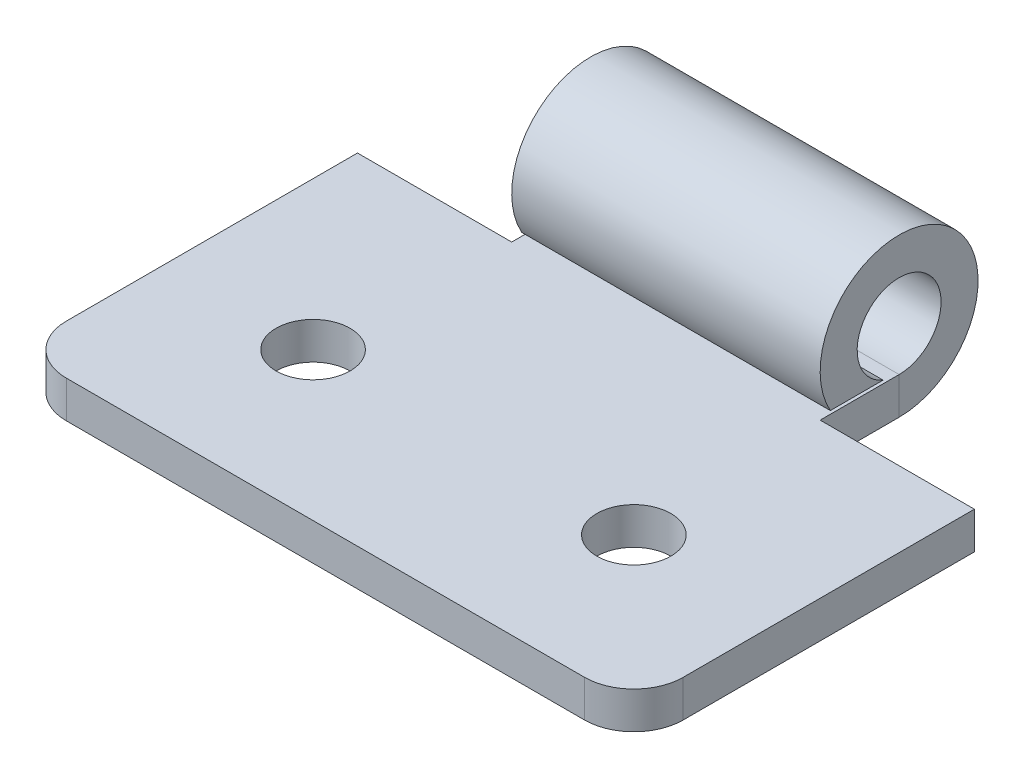
ISO-10303-21;
HEADER;
FILE_DESCRIPTION(('STEP AP214'),'2;1');
FILE_NAME('part.step','',(''),(''),'','','');
FILE_SCHEMA(('AUTOMOTIVE_DESIGN { 1 0 10303 214 1 1 1 1 }'));
ENDSEC;
DATA;
#1=APPLICATION_CONTEXT('core data for automotive mechanical design processes');
#2=APPLICATION_PROTOCOL_DEFINITION('international standard','automotive_design',2000,#1);
#3=PRODUCT_CONTEXT('',#1,'mechanical');
#4=PRODUCT('Part','Part','',(#3));
#5=PRODUCT_RELATED_PRODUCT_CATEGORY('part','',(#4));
#6=PRODUCT_DEFINITION_FORMATION('','',#4);
#7=PRODUCT_DEFINITION_CONTEXT('part definition',#1,'design');
#8=PRODUCT_DEFINITION('design','',#6,#7);
#9=PRODUCT_DEFINITION_SHAPE('','',#8);
#10=(LENGTH_UNIT() NAMED_UNIT(*) SI_UNIT(.MILLI.,.METRE.));
#11=(NAMED_UNIT(*) PLANE_ANGLE_UNIT() SI_UNIT($,.RADIAN.));
#12=(NAMED_UNIT(*) SI_UNIT($,.STERADIAN.) SOLID_ANGLE_UNIT());
#13=UNCERTAINTY_MEASURE_WITH_UNIT(LENGTH_MEASURE(1.E-05),#10,'distance_accuracy_value','');
#14=(GEOMETRIC_REPRESENTATION_CONTEXT(3) GLOBAL_UNCERTAINTY_ASSIGNED_CONTEXT((#13)) GLOBAL_UNIT_ASSIGNED_CONTEXT((#10,
#11,#12)) REPRESENTATION_CONTEXT('',''));
#15=CARTESIAN_POINT('',(0.,0.,0.));
#16=DIRECTION('',(0.,0.,1.));
#17=DIRECTION('',(1.,0.,0.));
#18=AXIS2_PLACEMENT_3D('',#15,#16,#17);
#19=CARTESIAN_POINT('',(6.24999999999998,1.7,-17.));
#20=DIRECTION('',(1.,0.,0.));
#21=DIRECTION('',(0.,0.,-1.));
#22=AXIS2_PLACEMENT_3D('',#19,#20,#21);
#23=CYLINDRICAL_SURFACE('',#22,1.7);
#24=CARTESIAN_POINT('',(18.75,1.7,-17.));
#25=DIRECTION('',(-1.,0.,0.));
#26=DIRECTION('',(0.,0.,-1.));
#27=AXIS2_PLACEMENT_3D('',#24,#25,#26);
#28=CIRCLE('',#27,1.7);
#29=CARTESIAN_POINT('',(18.75,0.129053697106962,-16.3502864373998));
#30=VERTEX_POINT('',#29);
#31=CARTESIAN_POINT('',(18.75,0.,-17.));
#32=VERTEX_POINT('',#31);
#33=EDGE_CURVE('E110',#30,#32,#28,.T.);
#34=ORIENTED_EDGE('',*,*,#33,.F.);
#35=DIRECTION('',(1.,0.,0.));
#36=VECTOR('',#35,1.);
#37=CARTESIAN_POINT('',(6.24999999999998,0.129053697106962,-16.3502864373998));
#38=LINE('',#37,#36);
#39=CARTESIAN_POINT('',(6.24999999999998,0.129053697106962,-16.3502864373998));
#40=VERTEX_POINT('',#39);
#41=EDGE_CURVE('E12',#40,#30,#38,.T.);
#42=ORIENTED_EDGE('',*,*,#41,.F.);
#43=CARTESIAN_POINT('',(6.24999999999998,1.7,-17.));
#44=DIRECTION('',(-1.,0.,0.));
#45=DIRECTION('',(0.,0.,-1.));
#46=AXIS2_PLACEMENT_3D('',#43,#44,#45);
#47=CIRCLE('',#46,1.7);
#48=CARTESIAN_POINT('',(6.24999999999998,0.,-17.));
#49=VERTEX_POINT('',#48);
#50=EDGE_CURVE('E104',#40,#49,#47,.T.);
#51=ORIENTED_EDGE('',*,*,#50,.T.);
#52=DIRECTION('',(1.,0.,0.));
#53=VECTOR('',#52,1.);
#54=CARTESIAN_POINT('',(6.24999999999998,0.,-17.));
#55=LINE('',#54,#53);
#56=EDGE_CURVE('E49',#49,#32,#55,.T.);
#57=ORIENTED_EDGE('',*,*,#56,.T.);
#58=EDGE_LOOP('',(#34,#42,#51,#57));
#59=FACE_BOUND('',#58,.T.);
#60=ADVANCED_FACE('F46',(#59),#23,.F.);
#61=CARTESIAN_POINT('',(6.24999999999998,0.129053697106962,-14.2121463967011));
#62=DIRECTION('',(0.,-1.,0.));
#63=DIRECTION('',(0.,0.,-1.));
#64=AXIS2_PLACEMENT_3D('',#61,#62,#63);
#65=PLANE('',#64);
#66=DIRECTION('',(0.,0.,-1.));
#67=VECTOR('',#66,1.);
#68=CARTESIAN_POINT('',(18.75,0.129053697106962,-14.2121463967011));
#69=LINE('',#68,#67);
#70=CARTESIAN_POINT('',(18.75,0.12905369710696,-14.2121463967011));
#71=VERTEX_POINT('',#70);
#72=EDGE_CURVE('E106',#71,#30,#69,.T.);
#73=ORIENTED_EDGE('',*,*,#72,.F.);
#74=DIRECTION('',(1.,0.,0.));
#75=VECTOR('',#74,1.);
#76=CARTESIAN_POINT('',(6.24999999999998,0.12905369710696,-14.2121463967011));
#77=LINE('',#76,#75);
#78=CARTESIAN_POINT('',(6.24999999999998,0.12905369710696,-14.2121463967011));
#79=VERTEX_POINT('',#78);
#80=EDGE_CURVE('E55',#79,#71,#77,.T.);
#81=ORIENTED_EDGE('',*,*,#80,.F.);
#82=DIRECTION('',(0.,0.,-1.));
#83=VECTOR('',#82,1.);
#84=CARTESIAN_POINT('',(6.24999999999998,0.129053697106962,-14.2121463967011));
#85=LINE('',#84,#83);
#86=EDGE_CURVE('E101',#79,#40,#85,.T.);
#87=ORIENTED_EDGE('',*,*,#86,.T.);
#88=ORIENTED_EDGE('',*,*,#41,.T.);
#89=EDGE_LOOP('',(#73,#81,#87,#88));
#90=FACE_BOUND('',#89,.T.);
#91=ADVANCED_FACE('F120',(#90),#65,.T.);
#92=CARTESIAN_POINT('',(6.24999999999998,1.7,-17.));
#93=DIRECTION('',(1.,0.,0.));
#94=DIRECTION('',(0.,0.,-1.));
#95=AXIS2_PLACEMENT_3D('',#92,#93,#94);
#96=CYLINDRICAL_SURFACE('',#95,3.2);
#97=CARTESIAN_POINT('',(18.75,1.7,-17.));
#98=DIRECTION('',(1.,0.,0.));
#99=DIRECTION('',(0.,0.,-1.));
#100=AXIS2_PLACEMENT_3D('',#97,#98,#99);
#101=CIRCLE('',#100,3.2);
#102=CARTESIAN_POINT('',(18.75,-1.5,-17.));
#103=VERTEX_POINT('',#102);
#104=EDGE_CURVE('E96',#103,#71,#101,.T.);
#105=ORIENTED_EDGE('',*,*,#104,.F.);
#106=DIRECTION('',(1.,0.,0.));
#107=VECTOR('',#106,1.);
#108=CARTESIAN_POINT('',(6.24999999999998,-1.5,-17.));
#109=LINE('',#108,#107);
#110=CARTESIAN_POINT('',(6.24999999999998,-1.5,-17.));
#111=VERTEX_POINT('',#110);
#112=EDGE_CURVE('E91',#111,#103,#109,.T.);
#113=ORIENTED_EDGE('',*,*,#112,.F.);
#114=CARTESIAN_POINT('',(6.24999999999998,1.7,-17.));
#115=DIRECTION('',(1.,0.,0.));
#116=DIRECTION('',(0.,0.,-1.));
#117=AXIS2_PLACEMENT_3D('',#114,#115,#116);
#118=CIRCLE('',#117,3.2);
#119=EDGE_CURVE('E94',#111,#79,#118,.T.);
#120=ORIENTED_EDGE('',*,*,#119,.T.);
#121=ORIENTED_EDGE('',*,*,#80,.T.);
#122=EDGE_LOOP('',(#105,#113,#120,#121));
#123=FACE_BOUND('',#122,.T.);
#124=ADVANCED_FACE('F93',(#123),#96,.T.);
#125=CARTESIAN_POINT('',(6.24999999999998,0.,-17.));
#126=DIRECTION('',(0.,0.,1.));
#127=DIRECTION('',(1.,0.,0.));
#128=AXIS2_PLACEMENT_3D('',#125,#126,#127);
#129=PLANE('',#128);
#130=DIRECTION('',(0.,-1.,0.));
#131=VECTOR('',#130,1.);
#132=CARTESIAN_POINT('',(18.75,0.,-17.));
#133=LINE('',#132,#131);
#134=EDGE_CURVE('E113',#32,#103,#133,.T.);
#135=ORIENTED_EDGE('',*,*,#134,.F.);
#136=ORIENTED_EDGE('',*,*,#56,.F.);
#137=DIRECTION('',(0.,-1.,0.));
#138=VECTOR('',#137,1.);
#139=CARTESIAN_POINT('',(6.24999999999998,0.,-17.));
#140=LINE('',#139,#138);
#141=EDGE_CURVE('E100',#49,#111,#140,.T.);
#142=ORIENTED_EDGE('',*,*,#141,.T.);
#143=ORIENTED_EDGE('',*,*,#112,.T.);
#144=EDGE_LOOP('',(#135,#136,#142,#143));
#145=FACE_BOUND('',#144,.T.);
#146=ADVANCED_FACE('F103',(#145),#129,.T.);
#147=CARTESIAN_POINT('',(6.24999999999998,1.7,-17.));
#148=DIRECTION('',(1.,0.,0.));
#149=DIRECTION('',(0.,0.,-1.));
#150=AXIS2_PLACEMENT_3D('',#147,#148,#149);
#151=PLANE('',#150);
#152=ORIENTED_EDGE('',*,*,#50,.F.);
#153=ORIENTED_EDGE('',*,*,#86,.F.);
#154=ORIENTED_EDGE('',*,*,#119,.F.);
#155=ORIENTED_EDGE('',*,*,#141,.F.);
#156=EDGE_LOOP('',(#152,#153,#154,#155));
#157=FACE_BOUND('',#156,.T.);
#158=ADVANCED_FACE('F99',(#157),#151,.F.);
#159=CARTESIAN_POINT('',(18.75,1.7,-17.));
#160=DIRECTION('',(1.,0.,0.));
#161=DIRECTION('',(0.,0.,-1.));
#162=AXIS2_PLACEMENT_3D('',#159,#160,#161);
#163=PLANE('',#162);
#164=ORIENTED_EDGE('',*,*,#33,.T.);
#165=ORIENTED_EDGE('',*,*,#134,.T.);
#166=ORIENTED_EDGE('',*,*,#104,.T.);
#167=ORIENTED_EDGE('',*,*,#72,.T.);
#168=EDGE_LOOP('',(#164,#165,#166,#167));
#169=FACE_BOUND('',#168,.T.);
#170=ADVANCED_FACE('F119',(#169),#163,.T.);
#171=CLOSED_SHELL('',(#60,#91,#124,#146,#158,#170));
#172=MANIFOLD_SOLID_BREP('B2',#171);
#173=CARTESIAN_POINT('',(0.,-1.5,0.));
#174=DIRECTION('',(-1.,0.,0.));
#175=DIRECTION('',(0.,0.,1.));
#176=AXIS2_PLACEMENT_3D('',#173,#174,#175);
#177=PLANE('',#176);
#178=DIRECTION('',(0.,1.,0.));
#179=VECTOR('',#178,1.);
#180=CARTESIAN_POINT('',(0.,-1.5,-13.8));
#181=LINE('',#180,#179);
#182=CARTESIAN_POINT('',(0.,-1.5,-13.8));
#183=VERTEX_POINT('',#182);
#184=CARTESIAN_POINT('',(0.,0.,-13.8));
#185=VERTEX_POINT('',#184);
#186=EDGE_CURVE('E283',#183,#185,#181,.T.);
#187=ORIENTED_EDGE('',*,*,#186,.F.);
#188=DIRECTION('',(0.,0.,1.));
#189=VECTOR('',#188,1.);
#190=CARTESIAN_POINT('',(0.,-1.5,0.));
#191=LINE('',#190,#189);
#192=CARTESIAN_POINT('',(0.,-1.5,-2.));
#193=VERTEX_POINT('',#192);
#194=EDGE_CURVE('E196',#183,#193,#191,.T.);
#195=ORIENTED_EDGE('',*,*,#194,.T.);
#196=DIRECTION('',(0.,1.,0.));
#197=VECTOR('',#196,1.);
#198=CARTESIAN_POINT('',(0.,-1.5,-2.));
#199=LINE('',#198,#197);
#200=CARTESIAN_POINT('',(0.,0.,-2.));
#201=VERTEX_POINT('',#200);
#202=EDGE_CURVE('E189',#193,#201,#199,.T.);
#203=ORIENTED_EDGE('',*,*,#202,.T.);
#204=DIRECTION('',(0.,0.,1.));
#205=VECTOR('',#204,1.);
#206=CARTESIAN_POINT('',(0.,0.,0.));
#207=LINE('',#206,#205);
#208=EDGE_CURVE('E321',#185,#201,#207,.T.);
#209=ORIENTED_EDGE('',*,*,#208,.F.);
#210=EDGE_LOOP('',(#187,#195,#203,#209));
#211=FACE_BOUND('',#210,.T.);
#212=ADVANCED_FACE('F181',(#211),#177,.T.);
#213=CARTESIAN_POINT('',(25.,-1.5,0.));
#214=DIRECTION('',(1.,0.,0.));
#215=DIRECTION('',(0.,0.,-1.));
#216=AXIS2_PLACEMENT_3D('',#213,#214,#215);
#217=PLANE('',#216);
#218=DIRECTION('',(0.,-1.,0.));
#219=VECTOR('',#218,1.);
#220=CARTESIAN_POINT('',(25.,-1.5,-13.8));
#221=LINE('',#220,#219);
#222=CARTESIAN_POINT('',(25.,0.,-13.8));
#223=VERTEX_POINT('',#222);
#224=CARTESIAN_POINT('',(25.,-1.5,-13.8));
#225=VERTEX_POINT('',#224);
#226=EDGE_CURVE('E295',#223,#225,#221,.T.);
#227=ORIENTED_EDGE('',*,*,#226,.F.);
#228=DIRECTION('',(0.,0.,-1.));
#229=VECTOR('',#228,1.);
#230=CARTESIAN_POINT('',(25.,0.,0.));
#231=LINE('',#230,#229);
#232=CARTESIAN_POINT('',(25.,0.,-2.));
#233=VERTEX_POINT('',#232);
#234=EDGE_CURVE('E325',#233,#223,#231,.T.);
#235=ORIENTED_EDGE('',*,*,#234,.F.);
#236=DIRECTION('',(0.,1.,0.));
#237=VECTOR('',#236,1.);
#238=CARTESIAN_POINT('',(25.,-1.5,-2.));
#239=LINE('',#238,#237);
#240=CARTESIAN_POINT('',(25.,-1.5,-2.));
#241=VERTEX_POINT('',#240);
#242=EDGE_CURVE('E204',#233,#241,#239,.F.);
#243=ORIENTED_EDGE('',*,*,#242,.T.);
#244=DIRECTION('',(0.,0.,-1.));
#245=VECTOR('',#244,1.);
#246=CARTESIAN_POINT('',(25.,-1.5,0.));
#247=LINE('',#246,#245);
#248=EDGE_CURVE('E328',#241,#225,#247,.T.);
#249=ORIENTED_EDGE('',*,*,#248,.T.);
#250=EDGE_LOOP('',(#227,#235,#243,#249));
#251=FACE_BOUND('',#250,.T.);
#252=ADVANCED_FACE('F364',(#251),#217,.T.);
#253=CARTESIAN_POINT('',(0.,-1.5,0.));
#254=DIRECTION('',(0.,0.,1.));
#255=DIRECTION('',(1.,0.,0.));
#256=AXIS2_PLACEMENT_3D('',#253,#254,#255);
#257=PLANE('',#256);
#258=DIRECTION('',(1.,0.,0.));
#259=VECTOR('',#258,1.);
#260=CARTESIAN_POINT('',(0.,-1.5,0.));
#261=LINE('',#260,#259);
#262=CARTESIAN_POINT('',(2.,-1.5,0.));
#263=VERTEX_POINT('',#262);
#264=CARTESIAN_POINT('',(23.,-1.5,0.));
#265=VERTEX_POINT('',#264);
#266=EDGE_CURVE('E324',#263,#265,#261,.T.);
#267=ORIENTED_EDGE('',*,*,#266,.T.);
#268=DIRECTION('',(0.,1.,0.));
#269=VECTOR('',#268,1.);
#270=CARTESIAN_POINT('',(23.,-1.5,0.));
#271=LINE('',#270,#269);
#272=CARTESIAN_POINT('',(23.,0.,0.));
#273=VERTEX_POINT('',#272);
#274=EDGE_CURVE('E338',#265,#273,#271,.T.);
#275=ORIENTED_EDGE('',*,*,#274,.T.);
#276=DIRECTION('',(1.,0.,0.));
#277=VECTOR('',#276,1.);
#278=CARTESIAN_POINT('',(0.,0.,0.));
#279=LINE('',#278,#277);
#280=CARTESIAN_POINT('',(2.,0.,0.));
#281=VERTEX_POINT('',#280);
#282=EDGE_CURVE('E332',#281,#273,#279,.T.);
#283=ORIENTED_EDGE('',*,*,#282,.F.);
#284=DIRECTION('',(0.,1.,0.));
#285=VECTOR('',#284,1.);
#286=CARTESIAN_POINT('',(2.,-1.5,0.));
#287=LINE('',#286,#285);
#288=EDGE_CURVE('E330',#281,#263,#287,.F.);
#289=ORIENTED_EDGE('',*,*,#288,.T.);
#290=EDGE_LOOP('',(#267,#275,#283,#289));
#291=FACE_BOUND('',#290,.T.);
#292=ADVANCED_FACE('F356',(#291),#257,.T.);
#293=CARTESIAN_POINT('',(0.,-1.5,0.));
#294=DIRECTION('',(0.,-1.,0.));
#295=DIRECTION('',(0.,0.,-1.));
#296=AXIS2_PLACEMENT_3D('',#293,#294,#295);
#297=PLANE('',#296);
#298=DIRECTION('',(-1.,0.,0.));
#299=VECTOR('',#298,1.);
#300=CARTESIAN_POINT('',(0.,-1.5,-13.8));
#301=LINE('',#300,#299);
#302=CARTESIAN_POINT('',(6.25000000000001,-1.5,-13.8));
#303=VERTEX_POINT('',#302);
#304=EDGE_CURVE('E280',#303,#183,#301,.T.);
#305=ORIENTED_EDGE('',*,*,#304,.F.);
#306=DIRECTION('',(0.,0.,1.));
#307=VECTOR('',#306,1.);
#308=CARTESIAN_POINT('',(6.25,-1.5,-17.));
#309=LINE('',#308,#307);
#310=CARTESIAN_POINT('',(6.25,-1.5,-17.));
#311=VERTEX_POINT('',#310);
#312=EDGE_CURVE('E277',#311,#303,#309,.T.);
#313=ORIENTED_EDGE('',*,*,#312,.F.);
#314=DIRECTION('',(-1.,0.,0.));
#315=VECTOR('',#314,1.);
#316=CARTESIAN_POINT('',(6.25,-1.5,-17.));
#317=LINE('',#316,#315);
#318=CARTESIAN_POINT('',(18.75,-1.5,-17.));
#319=VERTEX_POINT('',#318);
#320=EDGE_CURVE('E312',#319,#311,#317,.T.);
#321=ORIENTED_EDGE('',*,*,#320,.F.);
#322=DIRECTION('',(0.,0.,-1.));
#323=VECTOR('',#322,1.);
#324=CARTESIAN_POINT('',(18.75,-1.5,-15.));
#325=LINE('',#324,#323);
#326=CARTESIAN_POINT('',(18.75,-1.5,-13.8));
#327=VERTEX_POINT('',#326);
#328=EDGE_CURVE('E271',#327,#319,#325,.T.);
#329=ORIENTED_EDGE('',*,*,#328,.F.);
#330=DIRECTION('',(-1.,0.,0.));
#331=VECTOR('',#330,1.);
#332=CARTESIAN_POINT('',(0.,-1.5,-13.8));
#333=LINE('',#332,#331);
#334=EDGE_CURVE('E292',#225,#327,#333,.T.);
#335=ORIENTED_EDGE('',*,*,#334,.F.);
#336=ORIENTED_EDGE('',*,*,#248,.F.);
#337=CARTESIAN_POINT('',(23.,-1.5,-2.));
#338=DIRECTION('',(0.,-1.,0.));
#339=DIRECTION('',(0.,0.,-1.));
#340=AXIS2_PLACEMENT_3D('',#337,#338,#339);
#341=CIRCLE('',#340,2.);
#342=EDGE_CURVE('E348',#241,#265,#341,.T.);
#343=ORIENTED_EDGE('',*,*,#342,.T.);
#344=ORIENTED_EDGE('',*,*,#266,.F.);
#345=CARTESIAN_POINT('',(2.,-1.5,-2.));
#346=DIRECTION('',(0.,-1.,0.));
#347=DIRECTION('',(0.,0.,-1.));
#348=AXIS2_PLACEMENT_3D('',#345,#346,#347);
#349=CIRCLE('',#348,2.);
#350=EDGE_CURVE('E346',#263,#193,#349,.T.);
#351=ORIENTED_EDGE('',*,*,#350,.T.);
#352=ORIENTED_EDGE('',*,*,#194,.F.);
#353=EDGE_LOOP('',(#305,#313,#321,#329,#335,#336,#343,#344,#351,#352));
#354=FACE_BOUND('',#353,.T.);
#355=CARTESIAN_POINT('',(6.,-1.5,-6.));
#356=DIRECTION('',(0.,1.,0.));
#357=DIRECTION('',(0.,0.,1.));
#358=AXIS2_PLACEMENT_3D('',#355,#356,#357);
#359=CIRCLE('',#358,1.5);
#360=CARTESIAN_POINT('',(6.,-1.5,-4.5));
#361=VERTEX_POINT('',#360);
#362=EDGE_CURVE('E298',#361,#361,#359,.T.);
#363=ORIENTED_EDGE('',*,*,#362,.T.);
#364=EDGE_LOOP('',(#363));
#365=FACE_BOUND('',#364,.T.);
#366=CARTESIAN_POINT('',(19.,-1.5,-6.));
#367=DIRECTION('',(0.,1.,0.));
#368=DIRECTION('',(0.,0.,1.));
#369=AXIS2_PLACEMENT_3D('',#366,#367,#368);
#370=CIRCLE('',#369,1.5);
#371=CARTESIAN_POINT('',(19.,-1.5,-4.5));
#372=VERTEX_POINT('',#371);
#373=EDGE_CURVE('E304',#372,#372,#370,.T.);
#374=ORIENTED_EDGE('',*,*,#373,.T.);
#375=EDGE_LOOP('',(#374));
#376=FACE_BOUND('',#375,.T.);
#377=ADVANCED_FACE('F370',(#354,#365,#376),#297,.T.);
#378=CARTESIAN_POINT('',(0.,0.,0.));
#379=DIRECTION('',(0.,-1.,0.));
#380=DIRECTION('',(0.,0.,-1.));
#381=AXIS2_PLACEMENT_3D('',#378,#379,#380);
#382=PLANE('',#381);
#383=CARTESIAN_POINT('',(6.,0.,-6.));
#384=DIRECTION('',(0.,1.,0.));
#385=DIRECTION('',(0.,0.,1.));
#386=AXIS2_PLACEMENT_3D('',#383,#384,#385);
#387=CIRCLE('',#386,1.5);
#388=CARTESIAN_POINT('',(6.,0.,-4.5));
#389=VERTEX_POINT('',#388);
#390=EDGE_CURVE('E297',#389,#389,#387,.T.);
#391=ORIENTED_EDGE('',*,*,#390,.F.);
#392=EDGE_LOOP('',(#391));
#393=FACE_BOUND('',#392,.T.);
#394=CARTESIAN_POINT('',(19.,0.,-6.));
#395=DIRECTION('',(0.,1.,0.));
#396=DIRECTION('',(0.,0.,1.));
#397=AXIS2_PLACEMENT_3D('',#394,#395,#396);
#398=CIRCLE('',#397,1.5);
#399=CARTESIAN_POINT('',(19.,0.,-4.5));
#400=VERTEX_POINT('',#399);
#401=EDGE_CURVE('E301',#400,#400,#398,.T.);
#402=ORIENTED_EDGE('',*,*,#401,.F.);
#403=EDGE_LOOP('',(#402));
#404=FACE_BOUND('',#403,.T.);
#405=DIRECTION('',(0.,0.,1.));
#406=VECTOR('',#405,1.);
#407=CARTESIAN_POINT('',(6.25,0.,-17.));
#408=LINE('',#407,#406);
#409=CARTESIAN_POINT('',(6.25,0.,-17.));
#410=VERTEX_POINT('',#409);
#411=CARTESIAN_POINT('',(6.25000000000001,0.,-13.8));
#412=VERTEX_POINT('',#411);
#413=EDGE_CURVE('E262',#410,#412,#408,.T.);
#414=ORIENTED_EDGE('',*,*,#413,.T.);
#415=DIRECTION('',(-1.,0.,0.));
#416=VECTOR('',#415,1.);
#417=CARTESIAN_POINT('',(0.,0.,-13.8));
#418=LINE('',#417,#416);
#419=EDGE_CURVE('E44',#412,#185,#418,.T.);
#420=ORIENTED_EDGE('',*,*,#419,.T.);
#421=ORIENTED_EDGE('',*,*,#208,.T.);
#422=CARTESIAN_POINT('',(2.,0.,-2.));
#423=DIRECTION('',(0.,-1.,0.));
#424=DIRECTION('',(0.,0.,-1.));
#425=AXIS2_PLACEMENT_3D('',#422,#423,#424);
#426=CIRCLE('',#425,2.);
#427=EDGE_CURVE('E341',#201,#281,#426,.F.);
#428=ORIENTED_EDGE('',*,*,#427,.T.);
#429=ORIENTED_EDGE('',*,*,#282,.T.);
#430=CARTESIAN_POINT('',(23.,0.,-2.));
#431=DIRECTION('',(0.,-1.,0.));
#432=DIRECTION('',(0.,0.,-1.));
#433=AXIS2_PLACEMENT_3D('',#430,#431,#432);
#434=CIRCLE('',#433,2.);
#435=EDGE_CURVE('E343',#273,#233,#434,.F.);
#436=ORIENTED_EDGE('',*,*,#435,.T.);
#437=ORIENTED_EDGE('',*,*,#234,.T.);
#438=DIRECTION('',(1.,0.,0.));
#439=VECTOR('',#438,1.);
#440=CARTESIAN_POINT('',(18.75,0.,-13.8));
#441=LINE('',#440,#439);
#442=CARTESIAN_POINT('',(18.75,0.,-13.8));
#443=VERTEX_POINT('',#442);
#444=EDGE_CURVE('E284',#443,#223,#441,.T.);
#445=ORIENTED_EDGE('',*,*,#444,.F.);
#446=DIRECTION('',(0.,0.,-1.));
#447=VECTOR('',#446,1.);
#448=CARTESIAN_POINT('',(18.75,0.,-15.));
#449=LINE('',#448,#447);
#450=CARTESIAN_POINT('',(18.75,0.,-17.));
#451=VERTEX_POINT('',#450);
#452=EDGE_CURVE('E307',#443,#451,#449,.T.);
#453=ORIENTED_EDGE('',*,*,#452,.T.);
#454=DIRECTION('',(-1.,0.,0.));
#455=VECTOR('',#454,1.);
#456=CARTESIAN_POINT('',(6.25,0.,-17.));
#457=LINE('',#456,#455);
#458=EDGE_CURVE('E269',#451,#410,#457,.T.);
#459=ORIENTED_EDGE('',*,*,#458,.T.);
#460=EDGE_LOOP('',(#414,#420,#421,#428,#429,#436,#437,#445,#453,#459));
#461=FACE_BOUND('',#460,.T.);
#462=ADVANCED_FACE('F264',(#393,#404,#461),#382,.F.);
#463=CARTESIAN_POINT('',(18.75,-1.5,-15.));
#464=DIRECTION('',(1.,0.,0.));
#465=DIRECTION('',(0.,0.,-1.));
#466=AXIS2_PLACEMENT_3D('',#463,#464,#465);
#467=PLANE('',#466);
#468=ORIENTED_EDGE('',*,*,#452,.F.);
#469=DIRECTION('',(0.,1.,0.));
#470=VECTOR('',#469,1.);
#471=CARTESIAN_POINT('',(18.75,-25.,-13.8));
#472=LINE('',#471,#470);
#473=EDGE_CURVE('E286',#327,#443,#472,.T.);
#474=ORIENTED_EDGE('',*,*,#473,.F.);
#475=ORIENTED_EDGE('',*,*,#328,.T.);
#476=DIRECTION('',(0.,1.,0.));
#477=VECTOR('',#476,1.);
#478=CARTESIAN_POINT('',(18.75,-1.5,-17.));
#479=LINE('',#478,#477);
#480=EDGE_CURVE('E316',#319,#451,#479,.T.);
#481=ORIENTED_EDGE('',*,*,#480,.T.);
#482=EDGE_LOOP('',(#468,#474,#475,#481));
#483=FACE_BOUND('',#482,.T.);
#484=ADVANCED_FACE('F374',(#483),#467,.T.);
#485=CARTESIAN_POINT('',(6.25,-1.5,-17.));
#486=DIRECTION('',(-1.,0.,0.));
#487=DIRECTION('',(0.,0.,1.));
#488=AXIS2_PLACEMENT_3D('',#485,#486,#487);
#489=PLANE('',#488);
#490=ORIENTED_EDGE('',*,*,#413,.F.);
#491=DIRECTION('',(0.,1.,0.));
#492=VECTOR('',#491,1.);
#493=CARTESIAN_POINT('',(6.25,-1.5,-17.));
#494=LINE('',#493,#492);
#495=EDGE_CURVE('E319',#311,#410,#494,.T.);
#496=ORIENTED_EDGE('',*,*,#495,.F.);
#497=ORIENTED_EDGE('',*,*,#312,.T.);
#498=DIRECTION('',(0.,1.,0.));
#499=VECTOR('',#498,1.);
#500=CARTESIAN_POINT('',(6.25000000000001,-25.,-13.8));
#501=LINE('',#500,#499);
#502=EDGE_CURVE('E274',#303,#412,#501,.T.);
#503=ORIENTED_EDGE('',*,*,#502,.T.);
#504=EDGE_LOOP('',(#490,#496,#497,#503));
#505=FACE_BOUND('',#504,.T.);
#506=ADVANCED_FACE('F275',(#505),#489,.T.);
#507=CARTESIAN_POINT('',(6.25,-1.5,-17.));
#508=DIRECTION('',(0.,0.,-1.));
#509=DIRECTION('',(-1.,0.,0.));
#510=AXIS2_PLACEMENT_3D('',#507,#508,#509);
#511=PLANE('',#510);
#512=ORIENTED_EDGE('',*,*,#458,.F.);
#513=ORIENTED_EDGE('',*,*,#480,.F.);
#514=ORIENTED_EDGE('',*,*,#320,.T.);
#515=ORIENTED_EDGE('',*,*,#495,.T.);
#516=EDGE_LOOP('',(#512,#513,#514,#515));
#517=FACE_BOUND('',#516,.T.);
#518=ADVANCED_FACE('F376',(#517),#511,.T.);
#519=CARTESIAN_POINT('',(19.,-1.5,-6.));
#520=DIRECTION('',(0.,1.,0.));
#521=DIRECTION('',(0.,0.,1.));
#522=AXIS2_PLACEMENT_3D('',#519,#520,#521);
#523=CYLINDRICAL_SURFACE('',#522,1.5);
#524=ORIENTED_EDGE('',*,*,#373,.F.);
#525=EDGE_LOOP('',(#524));
#526=FACE_BOUND('',#525,.T.);
#527=ORIENTED_EDGE('',*,*,#401,.T.);
#528=EDGE_LOOP('',(#527));
#529=FACE_BOUND('',#528,.T.);
#530=ADVANCED_FACE('F378',(#526,#529),#523,.F.);
#531=CARTESIAN_POINT('',(6.,-1.5,-6.));
#532=DIRECTION('',(0.,1.,0.));
#533=DIRECTION('',(0.,0.,1.));
#534=AXIS2_PLACEMENT_3D('',#531,#532,#533);
#535=CYLINDRICAL_SURFACE('',#534,1.5);
#536=ORIENTED_EDGE('',*,*,#362,.F.);
#537=EDGE_LOOP('',(#536));
#538=FACE_BOUND('',#537,.T.);
#539=ORIENTED_EDGE('',*,*,#390,.T.);
#540=EDGE_LOOP('',(#539));
#541=FACE_BOUND('',#540,.T.);
#542=ADVANCED_FACE('F384',(#538,#541),#535,.F.);
#543=CARTESIAN_POINT('',(23.,-1.5,-2.));
#544=DIRECTION('',(0.,1.,0.));
#545=DIRECTION('',(0.,0.,1.));
#546=AXIS2_PLACEMENT_3D('',#543,#544,#545);
#547=CYLINDRICAL_SURFACE('',#546,2.);
#548=ORIENTED_EDGE('',*,*,#342,.F.);
#549=ORIENTED_EDGE('',*,*,#242,.F.);
#550=ORIENTED_EDGE('',*,*,#435,.F.);
#551=ORIENTED_EDGE('',*,*,#274,.F.);
#552=EDGE_LOOP('',(#548,#549,#550,#551));
#553=FACE_BOUND('',#552,.T.);
#554=ADVANCED_FACE('F361',(#553),#547,.T.);
#555=CARTESIAN_POINT('',(2.,-1.5,-2.));
#556=DIRECTION('',(0.,1.,0.));
#557=DIRECTION('',(0.,0.,1.));
#558=AXIS2_PLACEMENT_3D('',#555,#556,#557);
#559=CYLINDRICAL_SURFACE('',#558,2.);
#560=ORIENTED_EDGE('',*,*,#350,.F.);
#561=ORIENTED_EDGE('',*,*,#288,.F.);
#562=ORIENTED_EDGE('',*,*,#427,.F.);
#563=ORIENTED_EDGE('',*,*,#202,.F.);
#564=EDGE_LOOP('',(#560,#561,#562,#563));
#565=FACE_BOUND('',#564,.T.);
#566=ADVANCED_FACE('F183',(#565),#559,.T.);
#567=CARTESIAN_POINT('',(18.75,-25.,-13.8));
#568=DIRECTION('',(0.,0.,1.));
#569=DIRECTION('',(1.,0.,0.));
#570=AXIS2_PLACEMENT_3D('',#567,#568,#569);
#571=PLANE('',#570);
#572=ORIENTED_EDGE('',*,*,#226,.T.);
#573=ORIENTED_EDGE('',*,*,#334,.T.);
#574=ORIENTED_EDGE('',*,*,#473,.T.);
#575=ORIENTED_EDGE('',*,*,#444,.T.);
#576=EDGE_LOOP('',(#572,#573,#574,#575));
#577=FACE_BOUND('',#576,.T.);
#578=ADVANCED_FACE('F367',(#577),#571,.F.);
#579=CARTESIAN_POINT('',(6.25000000000001,-25.,-13.8));
#580=DIRECTION('',(0.,0.,1.));
#581=DIRECTION('',(1.,0.,0.));
#582=AXIS2_PLACEMENT_3D('',#579,#580,#581);
#583=PLANE('',#582);
#584=ORIENTED_EDGE('',*,*,#186,.T.);
#585=ORIENTED_EDGE('',*,*,#419,.F.);
#586=ORIENTED_EDGE('',*,*,#502,.F.);
#587=ORIENTED_EDGE('',*,*,#304,.T.);
#588=EDGE_LOOP('',(#584,#585,#586,#587));
#589=FACE_BOUND('',#588,.T.);
#590=ADVANCED_FACE('F282',(#589),#583,.F.);
#591=CLOSED_SHELL('',(#212,#252,#292,#377,#462,#484,#506,#518,#530,#542,#554,#566,#578,#590));
#592=MANIFOLD_SOLID_BREP('B6',#591);
#593=ADVANCED_BREP_SHAPE_REPRESENTATION('',(#18,#172,#592),#14);
#594=SHAPE_DEFINITION_REPRESENTATION(#9,#593);
ENDSEC;
END-ISO-10303-21;
